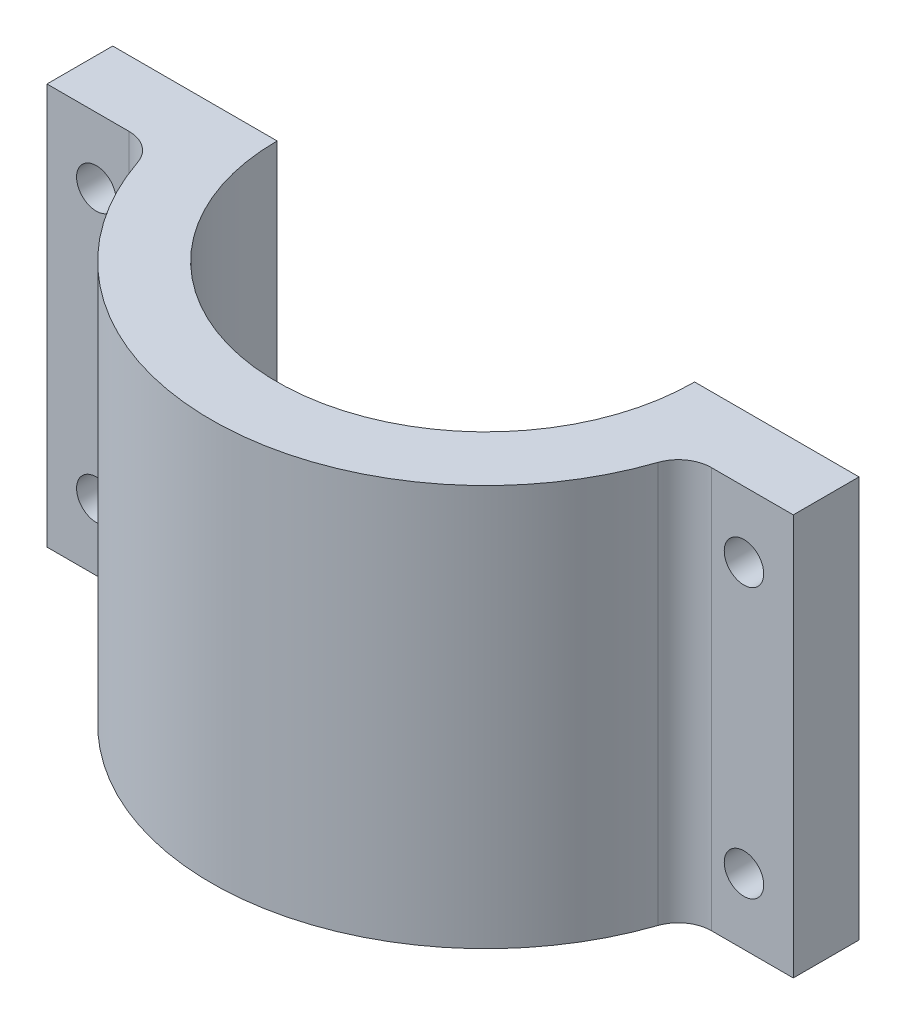
ISO-10303-21;
HEADER;
FILE_DESCRIPTION(('STEP AP214'),'2;1');
FILE_NAME('part.step','',(''),(''),'','','');
FILE_SCHEMA(('AUTOMOTIVE_DESIGN { 1 0 10303 214 1 1 1 1 }'));
ENDSEC;
DATA;
#1=APPLICATION_CONTEXT('core data for automotive mechanical design processes');
#2=APPLICATION_PROTOCOL_DEFINITION('international standard','automotive_design',2000,#1);
#3=PRODUCT_CONTEXT('',#1,'mechanical');
#4=PRODUCT('Part','Part','',(#3));
#5=PRODUCT_RELATED_PRODUCT_CATEGORY('part','',(#4));
#6=PRODUCT_DEFINITION_FORMATION('','',#4);
#7=PRODUCT_DEFINITION_CONTEXT('part definition',#1,'design');
#8=PRODUCT_DEFINITION('design','',#6,#7);
#9=PRODUCT_DEFINITION_SHAPE('','',#8);
#10=(LENGTH_UNIT() NAMED_UNIT(*) SI_UNIT(.MILLI.,.METRE.));
#11=(NAMED_UNIT(*) PLANE_ANGLE_UNIT() SI_UNIT($,.RADIAN.));
#12=(NAMED_UNIT(*) SI_UNIT($,.STERADIAN.) SOLID_ANGLE_UNIT());
#13=UNCERTAINTY_MEASURE_WITH_UNIT(LENGTH_MEASURE(1.E-05),#10,'distance_accuracy_value','');
#14=(GEOMETRIC_REPRESENTATION_CONTEXT(3) GLOBAL_UNCERTAINTY_ASSIGNED_CONTEXT((#13)) GLOBAL_UNIT_ASSIGNED_CONTEXT((#10,
#11,#12)) REPRESENTATION_CONTEXT('',''));
#15=CARTESIAN_POINT('',(0.,0.,0.));
#16=DIRECTION('',(0.,0.,1.));
#17=DIRECTION('',(1.,0.,0.));
#18=AXIS2_PLACEMENT_3D('',#15,#16,#17);
#19=CARTESIAN_POINT('',(0.,61.,0.));
#20=DIRECTION('',(0.,-1.,0.));
#21=DIRECTION('',(0.,0.,-1.));
#22=AXIS2_PLACEMENT_3D('',#19,#20,#21);
#23=CYLINDRICAL_SURFACE('',#22,31.75);
#24=CARTESIAN_POINT('',(0.,0.,0.));
#25=DIRECTION('',(0.,-1.,0.));
#26=DIRECTION('',(0.,0.,1.));
#27=AXIS2_PLACEMENT_3D('',#24,#25,#26);
#28=CIRCLE('',#27,31.75);
#29=CARTESIAN_POINT('',(31.75,0.,0.));
#30=VERTEX_POINT('',#29);
#31=CARTESIAN_POINT('',(-31.75,0.,0.));
#32=VERTEX_POINT('',#31);
#33=EDGE_CURVE('E133',#30,#32,#28,.T.);
#34=ORIENTED_EDGE('',*,*,#33,.T.);
#35=DIRECTION('',(0.,-1.,0.));
#36=VECTOR('',#35,1.);
#37=CARTESIAN_POINT('',(-31.75,61.,0.));
#38=LINE('',#37,#36);
#39=CARTESIAN_POINT('',(-31.75,61.,0.));
#40=VERTEX_POINT('',#39);
#41=EDGE_CURVE('E114',#40,#32,#38,.T.);
#42=ORIENTED_EDGE('',*,*,#41,.F.);
#43=CARTESIAN_POINT('',(0.,61.,0.));
#44=DIRECTION('',(0.,-1.,0.));
#45=DIRECTION('',(0.,0.,1.));
#46=AXIS2_PLACEMENT_3D('',#43,#44,#45);
#47=CIRCLE('',#46,31.75);
#48=CARTESIAN_POINT('',(31.75,61.,0.));
#49=VERTEX_POINT('',#48);
#50=EDGE_CURVE('E121',#49,#40,#47,.T.);
#51=ORIENTED_EDGE('',*,*,#50,.F.);
#52=DIRECTION('',(0.,-1.,0.));
#53=VECTOR('',#52,1.);
#54=CARTESIAN_POINT('',(31.75,61.,0.));
#55=LINE('',#54,#53);
#56=EDGE_CURVE('E189',#49,#30,#55,.T.);
#57=ORIENTED_EDGE('',*,*,#56,.T.);
#58=EDGE_LOOP('',(#34,#42,#51,#57));
#59=FACE_BOUND('',#58,.T.);
#60=ADVANCED_FACE('F33',(#59),#23,.F.);
#61=CARTESIAN_POINT('',(-41.75,61.,0.));
#62=DIRECTION('',(0.,0.,1.));
#63=DIRECTION('',(1.,0.,0.));
#64=AXIS2_PLACEMENT_3D('',#61,#62,#63);
#65=PLANE('',#64);
#66=CARTESIAN_POINT('',(-49.25,10.,0.));
#67=DIRECTION('',(0.,0.,1.));
#68=DIRECTION('',(1.,0.,0.));
#69=AXIS2_PLACEMENT_3D('',#66,#67,#68);
#70=CIRCLE('',#69,3.);
#71=CARTESIAN_POINT('',(-46.25,10.,0.));
#72=VERTEX_POINT('',#71);
#73=EDGE_CURVE('E213',#72,#72,#70,.T.);
#74=ORIENTED_EDGE('',*,*,#73,.T.);
#75=EDGE_LOOP('',(#74));
#76=FACE_BOUND('',#75,.T.);
#77=CARTESIAN_POINT('',(-49.25,51.,0.));
#78=DIRECTION('',(0.,0.,1.));
#79=DIRECTION('',(1.,0.,0.));
#80=AXIS2_PLACEMENT_3D('',#77,#78,#79);
#81=CIRCLE('',#80,3.);
#82=CARTESIAN_POINT('',(-46.25,51.,0.));
#83=VERTEX_POINT('',#82);
#84=EDGE_CURVE('E204',#83,#83,#81,.T.);
#85=ORIENTED_EDGE('',*,*,#84,.T.);
#86=EDGE_LOOP('',(#85));
#87=FACE_BOUND('',#86,.T.);
#88=DIRECTION('',(-1.,0.,0.));
#89=VECTOR('',#88,1.);
#90=CARTESIAN_POINT('',(-41.75,0.,0.));
#91=LINE('',#90,#89);
#92=CARTESIAN_POINT('',(-56.75,0.,0.));
#93=VERTEX_POINT('',#92);
#94=EDGE_CURVE('E200',#32,#93,#91,.T.);
#95=ORIENTED_EDGE('',*,*,#94,.T.);
#96=DIRECTION('',(0.,-1.,0.));
#97=VECTOR('',#96,1.);
#98=CARTESIAN_POINT('',(-56.75,61.,0.));
#99=LINE('',#98,#97);
#100=CARTESIAN_POINT('',(-56.75,61.,0.));
#101=VERTEX_POINT('',#100);
#102=EDGE_CURVE('E117',#101,#93,#99,.T.);
#103=ORIENTED_EDGE('',*,*,#102,.F.);
#104=DIRECTION('',(-1.,0.,0.));
#105=VECTOR('',#104,1.);
#106=CARTESIAN_POINT('',(-31.75,61.,0.));
#107=LINE('',#106,#105);
#108=EDGE_CURVE('E110',#40,#101,#107,.T.);
#109=ORIENTED_EDGE('',*,*,#108,.F.);
#110=ORIENTED_EDGE('',*,*,#41,.T.);
#111=EDGE_LOOP('',(#95,#103,#109,#110));
#112=FACE_BOUND('',#111,.T.);
#113=ADVANCED_FACE('F112',(#76,#87,#112),#65,.F.);
#114=CARTESIAN_POINT('',(-56.75,61.,0.));
#115=DIRECTION('',(1.,0.,0.));
#116=DIRECTION('',(0.,0.,-1.));
#117=AXIS2_PLACEMENT_3D('',#114,#115,#116);
#118=PLANE('',#117);
#119=DIRECTION('',(0.,0.,1.));
#120=VECTOR('',#119,1.);
#121=CARTESIAN_POINT('',(-56.75,0.,0.));
#122=LINE('',#121,#120);
#123=CARTESIAN_POINT('',(-56.75,0.,10.));
#124=VERTEX_POINT('',#123);
#125=EDGE_CURVE('E182',#93,#124,#122,.T.);
#126=ORIENTED_EDGE('',*,*,#125,.T.);
#127=DIRECTION('',(0.,-1.,0.));
#128=VECTOR('',#127,1.);
#129=CARTESIAN_POINT('',(-56.75,61.,10.));
#130=LINE('',#129,#128);
#131=CARTESIAN_POINT('',(-56.75,61.,10.));
#132=VERTEX_POINT('',#131);
#133=EDGE_CURVE('E139',#132,#124,#130,.T.);
#134=ORIENTED_EDGE('',*,*,#133,.F.);
#135=DIRECTION('',(0.,0.,1.));
#136=VECTOR('',#135,1.);
#137=CARTESIAN_POINT('',(-56.75,61.,0.));
#138=LINE('',#137,#136);
#139=EDGE_CURVE('E120',#101,#132,#138,.T.);
#140=ORIENTED_EDGE('',*,*,#139,.F.);
#141=ORIENTED_EDGE('',*,*,#102,.T.);
#142=EDGE_LOOP('',(#126,#134,#140,#141));
#143=FACE_BOUND('',#142,.T.);
#144=ADVANCED_FACE('F245',(#143),#118,.F.);
#145=CARTESIAN_POINT('',(-56.75,61.,10.));
#146=DIRECTION('',(0.,0.,-1.));
#147=DIRECTION('',(-1.,0.,0.));
#148=AXIS2_PLACEMENT_3D('',#145,#146,#147);
#149=PLANE('',#148);
#150=CARTESIAN_POINT('',(-49.25,10.,10.));
#151=DIRECTION('',(0.,0.,1.));
#152=DIRECTION('',(1.,0.,0.));
#153=AXIS2_PLACEMENT_3D('',#150,#151,#152);
#154=CIRCLE('',#153,3.);
#155=CARTESIAN_POINT('',(-46.25,10.,10.));
#156=VERTEX_POINT('',#155);
#157=EDGE_CURVE('E228',#156,#156,#154,.T.);
#158=ORIENTED_EDGE('',*,*,#157,.F.);
#159=EDGE_LOOP('',(#158));
#160=FACE_BOUND('',#159,.T.);
#161=CARTESIAN_POINT('',(-49.25,51.,10.));
#162=DIRECTION('',(0.,0.,1.));
#163=DIRECTION('',(1.,0.,0.));
#164=AXIS2_PLACEMENT_3D('',#161,#162,#163);
#165=CIRCLE('',#164,3.);
#166=CARTESIAN_POINT('',(-46.25,51.,10.));
#167=VERTEX_POINT('',#166);
#168=EDGE_CURVE('E210',#167,#167,#165,.T.);
#169=ORIENTED_EDGE('',*,*,#168,.F.);
#170=EDGE_LOOP('',(#169));
#171=FACE_BOUND('',#170,.T.);
#172=DIRECTION('',(1.,0.,0.));
#173=VECTOR('',#172,1.);
#174=CARTESIAN_POINT('',(-56.75,0.,10.));
#175=LINE('',#174,#173);
#176=CARTESIAN_POINT('',(-44.2782395765685,0.,10.));
#177=VERTEX_POINT('',#176);
#178=EDGE_CURVE('E178',#124,#177,#175,.T.);
#179=ORIENTED_EDGE('',*,*,#178,.T.);
#180=DIRECTION('',(0.,1.,0.));
#181=VECTOR('',#180,1.);
#182=CARTESIAN_POINT('',(-44.2782395765685,61.,10.));
#183=LINE('',#182,#181);
#184=CARTESIAN_POINT('',(-44.2782395765685,61.,10.));
#185=VERTEX_POINT('',#184);
#186=EDGE_CURVE('E48',#177,#185,#183,.T.);
#187=ORIENTED_EDGE('',*,*,#186,.T.);
#188=DIRECTION('',(1.,0.,0.));
#189=VECTOR('',#188,1.);
#190=CARTESIAN_POINT('',(-56.75,61.,10.));
#191=LINE('',#190,#189);
#192=EDGE_CURVE('E197',#132,#185,#191,.T.);
#193=ORIENTED_EDGE('',*,*,#192,.F.);
#194=ORIENTED_EDGE('',*,*,#133,.T.);
#195=EDGE_LOOP('',(#179,#187,#193,#194));
#196=FACE_BOUND('',#195,.T.);
#197=ADVANCED_FACE('F196',(#160,#171,#196),#149,.F.);
#198=CARTESIAN_POINT('',(0.,61.,0.));
#199=DIRECTION('',(0.,-1.,0.));
#200=DIRECTION('',(0.,0.,-1.));
#201=AXIS2_PLACEMENT_3D('',#198,#199,#200);
#202=CYLINDRICAL_SURFACE('',#201,41.75);
#203=CARTESIAN_POINT('',(0.,0.,0.));
#204=DIRECTION('',(0.,1.,0.));
#205=DIRECTION('',(0.,0.,1.));
#206=AXIS2_PLACEMENT_3D('',#203,#204,#205);
#207=CIRCLE('',#206,41.75);
#208=CARTESIAN_POINT('',(-39.5425989801441,0.,13.3957219251337));
#209=VERTEX_POINT('',#208);
#210=CARTESIAN_POINT('',(39.5425989801441,0.,13.3957219251337));
#211=VERTEX_POINT('',#210);
#212=EDGE_CURVE('E172',#209,#211,#207,.T.);
#213=ORIENTED_EDGE('',*,*,#212,.T.);
#214=DIRECTION('',(0.,-1.,0.));
#215=VECTOR('',#214,1.);
#216=CARTESIAN_POINT('',(39.5425989801441,61.,13.3957219251337));
#217=LINE('',#216,#215);
#218=CARTESIAN_POINT('',(39.5425989801441,61.,13.3957219251337));
#219=VERTEX_POINT('',#218);
#220=EDGE_CURVE('E145',#211,#219,#217,.F.);
#221=ORIENTED_EDGE('',*,*,#220,.T.);
#222=CARTESIAN_POINT('',(0.,61.,0.));
#223=DIRECTION('',(0.,1.,0.));
#224=DIRECTION('',(0.,0.,1.));
#225=AXIS2_PLACEMENT_3D('',#222,#223,#224);
#226=CIRCLE('',#225,41.75);
#227=CARTESIAN_POINT('',(-39.5425989801441,61.,13.3957219251337));
#228=VERTEX_POINT('',#227);
#229=EDGE_CURVE('E157',#228,#219,#226,.T.);
#230=ORIENTED_EDGE('',*,*,#229,.F.);
#231=DIRECTION('',(0.,-1.,0.));
#232=VECTOR('',#231,1.);
#233=CARTESIAN_POINT('',(-39.5425989801441,61.,13.3957219251337));
#234=LINE('',#233,#232);
#235=EDGE_CURVE('E137',#228,#209,#234,.T.);
#236=ORIENTED_EDGE('',*,*,#235,.T.);
#237=EDGE_LOOP('',(#213,#221,#230,#236));
#238=FACE_BOUND('',#237,.T.);
#239=ADVANCED_FACE('F176',(#238),#202,.T.);
#240=CARTESIAN_POINT('',(56.75,61.,10.));
#241=DIRECTION('',(0.,0.,-1.));
#242=DIRECTION('',(-1.,0.,0.));
#243=AXIS2_PLACEMENT_3D('',#240,#241,#242);
#244=PLANE('',#243);
#245=CARTESIAN_POINT('',(49.25,51.,10.));
#246=DIRECTION('',(0.,0.,1.));
#247=DIRECTION('',(-1.,0.,0.));
#248=AXIS2_PLACEMENT_3D('',#245,#246,#247);
#249=CIRCLE('',#248,3.);
#250=CARTESIAN_POINT('',(46.25,51.,10.));
#251=VERTEX_POINT('',#250);
#252=EDGE_CURVE('E216',#251,#251,#249,.T.);
#253=ORIENTED_EDGE('',*,*,#252,.F.);
#254=EDGE_LOOP('',(#253));
#255=FACE_BOUND('',#254,.T.);
#256=CARTESIAN_POINT('',(49.25,10.,10.));
#257=DIRECTION('',(0.,0.,1.));
#258=DIRECTION('',(-1.,0.,0.));
#259=AXIS2_PLACEMENT_3D('',#256,#257,#258);
#260=CIRCLE('',#259,3.);
#261=CARTESIAN_POINT('',(46.25,10.,10.));
#262=VERTEX_POINT('',#261);
#263=EDGE_CURVE('E222',#262,#262,#260,.T.);
#264=ORIENTED_EDGE('',*,*,#263,.F.);
#265=EDGE_LOOP('',(#264));
#266=FACE_BOUND('',#265,.T.);
#267=DIRECTION('',(1.,0.,0.));
#268=VECTOR('',#267,1.);
#269=CARTESIAN_POINT('',(56.75,61.,10.));
#270=LINE('',#269,#268);
#271=CARTESIAN_POINT('',(44.2782395765685,61.,10.));
#272=VERTEX_POINT('',#271);
#273=CARTESIAN_POINT('',(56.75,61.,10.));
#274=VERTEX_POINT('',#273);
#275=EDGE_CURVE('E154',#272,#274,#270,.T.);
#276=ORIENTED_EDGE('',*,*,#275,.F.);
#277=DIRECTION('',(0.,1.,0.));
#278=VECTOR('',#277,1.);
#279=CARTESIAN_POINT('',(44.2782395765685,0.,10.));
#280=LINE('',#279,#278);
#281=CARTESIAN_POINT('',(44.2782395765685,0.,10.));
#282=VERTEX_POINT('',#281);
#283=EDGE_CURVE('E134',#272,#282,#280,.F.);
#284=ORIENTED_EDGE('',*,*,#283,.T.);
#285=DIRECTION('',(1.,0.,0.));
#286=VECTOR('',#285,1.);
#287=CARTESIAN_POINT('',(56.75,0.,10.));
#288=LINE('',#287,#286);
#289=CARTESIAN_POINT('',(56.75,0.,10.));
#290=VERTEX_POINT('',#289);
#291=EDGE_CURVE('E174',#282,#290,#288,.T.);
#292=ORIENTED_EDGE('',*,*,#291,.T.);
#293=DIRECTION('',(0.,-1.,0.));
#294=VECTOR('',#293,1.);
#295=CARTESIAN_POINT('',(56.75,61.,10.));
#296=LINE('',#295,#294);
#297=EDGE_CURVE('E165',#274,#290,#296,.T.);
#298=ORIENTED_EDGE('',*,*,#297,.F.);
#299=EDGE_LOOP('',(#276,#284,#292,#298));
#300=FACE_BOUND('',#299,.T.);
#301=ADVANCED_FACE('F162',(#255,#266,#300),#244,.F.);
#302=CARTESIAN_POINT('',(56.75,61.,0.));
#303=DIRECTION('',(-1.,0.,0.));
#304=DIRECTION('',(0.,0.,1.));
#305=AXIS2_PLACEMENT_3D('',#302,#303,#304);
#306=PLANE('',#305);
#307=DIRECTION('',(0.,0.,-1.));
#308=VECTOR('',#307,1.);
#309=CARTESIAN_POINT('',(56.75,0.,0.));
#310=LINE('',#309,#308);
#311=CARTESIAN_POINT('',(56.75,0.,0.));
#312=VERTEX_POINT('',#311);
#313=EDGE_CURVE('E180',#290,#312,#310,.T.);
#314=ORIENTED_EDGE('',*,*,#313,.T.);
#315=DIRECTION('',(0.,-1.,0.));
#316=VECTOR('',#315,1.);
#317=CARTESIAN_POINT('',(56.75,61.,0.));
#318=LINE('',#317,#316);
#319=CARTESIAN_POINT('',(56.75,61.,0.));
#320=VERTEX_POINT('',#319);
#321=EDGE_CURVE('E191',#320,#312,#318,.T.);
#322=ORIENTED_EDGE('',*,*,#321,.F.);
#323=DIRECTION('',(0.,0.,-1.));
#324=VECTOR('',#323,1.);
#325=CARTESIAN_POINT('',(56.75,61.,0.));
#326=LINE('',#325,#324);
#327=EDGE_CURVE('E167',#274,#320,#326,.T.);
#328=ORIENTED_EDGE('',*,*,#327,.F.);
#329=ORIENTED_EDGE('',*,*,#297,.T.);
#330=EDGE_LOOP('',(#314,#322,#328,#329));
#331=FACE_BOUND('',#330,.T.);
#332=ADVANCED_FACE('F284',(#331),#306,.F.);
#333=CARTESIAN_POINT('',(31.75,61.,0.));
#334=DIRECTION('',(0.,0.,1.));
#335=DIRECTION('',(1.,0.,0.));
#336=AXIS2_PLACEMENT_3D('',#333,#334,#335);
#337=PLANE('',#336);
#338=CARTESIAN_POINT('',(49.25,51.,0.));
#339=DIRECTION('',(0.,0.,1.));
#340=DIRECTION('',(-1.,0.,0.));
#341=AXIS2_PLACEMENT_3D('',#338,#339,#340);
#342=CIRCLE('',#341,3.);
#343=CARTESIAN_POINT('',(46.25,51.,0.));
#344=VERTEX_POINT('',#343);
#345=EDGE_CURVE('E219',#344,#344,#342,.T.);
#346=ORIENTED_EDGE('',*,*,#345,.T.);
#347=EDGE_LOOP('',(#346));
#348=FACE_BOUND('',#347,.T.);
#349=CARTESIAN_POINT('',(49.25,10.,0.));
#350=DIRECTION('',(0.,0.,1.));
#351=DIRECTION('',(-1.,0.,0.));
#352=AXIS2_PLACEMENT_3D('',#349,#350,#351);
#353=CIRCLE('',#352,3.);
#354=CARTESIAN_POINT('',(46.25,10.,0.));
#355=VERTEX_POINT('',#354);
#356=EDGE_CURVE('E225',#355,#355,#353,.T.);
#357=ORIENTED_EDGE('',*,*,#356,.T.);
#358=EDGE_LOOP('',(#357));
#359=FACE_BOUND('',#358,.T.);
#360=DIRECTION('',(-1.,0.,0.));
#361=VECTOR('',#360,1.);
#362=CARTESIAN_POINT('',(31.75,0.,0.));
#363=LINE('',#362,#361);
#364=EDGE_CURVE('E130',#312,#30,#363,.T.);
#365=ORIENTED_EDGE('',*,*,#364,.T.);
#366=ORIENTED_EDGE('',*,*,#56,.F.);
#367=DIRECTION('',(-1.,0.,0.));
#368=VECTOR('',#367,1.);
#369=CARTESIAN_POINT('',(41.75,61.,0.));
#370=LINE('',#369,#368);
#371=EDGE_CURVE('E126',#320,#49,#370,.T.);
#372=ORIENTED_EDGE('',*,*,#371,.F.);
#373=ORIENTED_EDGE('',*,*,#321,.T.);
#374=EDGE_LOOP('',(#365,#366,#372,#373));
#375=FACE_BOUND('',#374,.T.);
#376=ADVANCED_FACE('F288',(#348,#359,#375),#337,.F.);
#377=CARTESIAN_POINT('',(0.,61.,0.));
#378=DIRECTION('',(0.,1.,0.));
#379=DIRECTION('',(0.,0.,1.));
#380=AXIS2_PLACEMENT_3D('',#377,#378,#379);
#381=PLANE('',#380);
#382=ORIENTED_EDGE('',*,*,#50,.T.);
#383=ORIENTED_EDGE('',*,*,#108,.T.);
#384=ORIENTED_EDGE('',*,*,#139,.T.);
#385=ORIENTED_EDGE('',*,*,#192,.T.);
#386=CARTESIAN_POINT('',(-44.2782395765685,61.,15.));
#387=DIRECTION('',(0.,1.,0.));
#388=DIRECTION('',(0.,0.,1.));
#389=AXIS2_PLACEMENT_3D('',#386,#387,#388);
#390=CIRCLE('',#389,5.);
#391=EDGE_CURVE('E11',#185,#228,#390,.F.);
#392=ORIENTED_EDGE('',*,*,#391,.T.);
#393=ORIENTED_EDGE('',*,*,#229,.T.);
#394=CARTESIAN_POINT('',(44.2782395765685,61.,15.));
#395=DIRECTION('',(0.,1.,0.));
#396=DIRECTION('',(0.,0.,1.));
#397=AXIS2_PLACEMENT_3D('',#394,#395,#396);
#398=CIRCLE('',#397,5.);
#399=EDGE_CURVE('E150',#219,#272,#398,.F.);
#400=ORIENTED_EDGE('',*,*,#399,.T.);
#401=ORIENTED_EDGE('',*,*,#275,.T.);
#402=ORIENTED_EDGE('',*,*,#327,.T.);
#403=ORIENTED_EDGE('',*,*,#371,.T.);
#404=EDGE_LOOP('',(#382,#383,#384,#385,#392,#393,#400,#401,#402,#403));
#405=FACE_BOUND('',#404,.T.);
#406=ADVANCED_FACE('F124',(#405),#381,.T.);
#407=CARTESIAN_POINT('',(0.,0.,0.));
#408=DIRECTION('',(0.,1.,0.));
#409=DIRECTION('',(0.,0.,1.));
#410=AXIS2_PLACEMENT_3D('',#407,#408,#409);
#411=PLANE('',#410);
#412=ORIENTED_EDGE('',*,*,#33,.F.);
#413=ORIENTED_EDGE('',*,*,#364,.F.);
#414=ORIENTED_EDGE('',*,*,#313,.F.);
#415=ORIENTED_EDGE('',*,*,#291,.F.);
#416=CARTESIAN_POINT('',(44.2782395765685,0.,15.));
#417=DIRECTION('',(0.,1.,0.));
#418=DIRECTION('',(0.,0.,1.));
#419=AXIS2_PLACEMENT_3D('',#416,#417,#418);
#420=CIRCLE('',#419,5.);
#421=EDGE_CURVE('E148',#282,#211,#420,.T.);
#422=ORIENTED_EDGE('',*,*,#421,.T.);
#423=ORIENTED_EDGE('',*,*,#212,.F.);
#424=CARTESIAN_POINT('',(-44.2782395765685,0.,15.));
#425=DIRECTION('',(0.,1.,0.));
#426=DIRECTION('',(0.,0.,1.));
#427=AXIS2_PLACEMENT_3D('',#424,#425,#426);
#428=CIRCLE('',#427,5.);
#429=EDGE_CURVE('E41',#209,#177,#428,.T.);
#430=ORIENTED_EDGE('',*,*,#429,.T.);
#431=ORIENTED_EDGE('',*,*,#178,.F.);
#432=ORIENTED_EDGE('',*,*,#125,.F.);
#433=ORIENTED_EDGE('',*,*,#94,.F.);
#434=EDGE_LOOP('',(#412,#413,#414,#415,#422,#423,#430,#431,#432,#433));
#435=FACE_BOUND('',#434,.T.);
#436=ADVANCED_FACE('F171',(#435),#411,.F.);
#437=CARTESIAN_POINT('',(49.25,10.,0.));
#438=DIRECTION('',(0.,0.,1.));
#439=DIRECTION('',(1.,0.,0.));
#440=AXIS2_PLACEMENT_3D('',#437,#438,#439);
#441=CYLINDRICAL_SURFACE('',#440,3.);
#442=ORIENTED_EDGE('',*,*,#356,.F.);
#443=EDGE_LOOP('',(#442));
#444=FACE_BOUND('',#443,.T.);
#445=ORIENTED_EDGE('',*,*,#263,.T.);
#446=EDGE_LOOP('',(#445));
#447=FACE_BOUND('',#446,.T.);
#448=ADVANCED_FACE('F256',(#444,#447),#441,.F.);
#449=CARTESIAN_POINT('',(49.25,51.,0.));
#450=DIRECTION('',(0.,0.,1.));
#451=DIRECTION('',(1.,0.,0.));
#452=AXIS2_PLACEMENT_3D('',#449,#450,#451);
#453=CYLINDRICAL_SURFACE('',#452,3.);
#454=ORIENTED_EDGE('',*,*,#345,.F.);
#455=EDGE_LOOP('',(#454));
#456=FACE_BOUND('',#455,.T.);
#457=ORIENTED_EDGE('',*,*,#252,.T.);
#458=EDGE_LOOP('',(#457));
#459=FACE_BOUND('',#458,.T.);
#460=ADVANCED_FACE('F250',(#456,#459),#453,.F.);
#461=CARTESIAN_POINT('',(-49.25,51.,0.));
#462=DIRECTION('',(0.,0.,1.));
#463=DIRECTION('',(1.,0.,0.));
#464=AXIS2_PLACEMENT_3D('',#461,#462,#463);
#465=CYLINDRICAL_SURFACE('',#464,3.);
#466=ORIENTED_EDGE('',*,*,#84,.F.);
#467=EDGE_LOOP('',(#466));
#468=FACE_BOUND('',#467,.T.);
#469=ORIENTED_EDGE('',*,*,#168,.T.);
#470=EDGE_LOOP('',(#469));
#471=FACE_BOUND('',#470,.T.);
#472=ADVANCED_FACE('F239',(#468,#471),#465,.F.);
#473=CARTESIAN_POINT('',(-49.25,10.,0.));
#474=DIRECTION('',(0.,0.,1.));
#475=DIRECTION('',(1.,0.,0.));
#476=AXIS2_PLACEMENT_3D('',#473,#474,#475);
#477=CYLINDRICAL_SURFACE('',#476,3.);
#478=ORIENTED_EDGE('',*,*,#73,.F.);
#479=EDGE_LOOP('',(#478));
#480=FACE_BOUND('',#479,.T.);
#481=ORIENTED_EDGE('',*,*,#157,.T.);
#482=EDGE_LOOP('',(#481));
#483=FACE_BOUND('',#482,.T.);
#484=ADVANCED_FACE('F236',(#480,#483),#477,.F.);
#485=CARTESIAN_POINT('',(44.2782395765685,61.,15.));
#486=DIRECTION('',(0.,-1.,0.));
#487=DIRECTION('',(0.,0.,-1.));
#488=AXIS2_PLACEMENT_3D('',#485,#486,#487);
#489=CYLINDRICAL_SURFACE('',#488,5.);
#490=ORIENTED_EDGE('',*,*,#399,.F.);
#491=ORIENTED_EDGE('',*,*,#220,.F.);
#492=ORIENTED_EDGE('',*,*,#421,.F.);
#493=ORIENTED_EDGE('',*,*,#283,.F.);
#494=EDGE_LOOP('',(#490,#491,#492,#493));
#495=FACE_BOUND('',#494,.T.);
#496=ADVANCED_FACE('F169',(#495),#489,.F.);
#497=CARTESIAN_POINT('',(-44.2782395765685,61.,15.));
#498=DIRECTION('',(0.,-1.,0.));
#499=DIRECTION('',(0.,0.,-1.));
#500=AXIS2_PLACEMENT_3D('',#497,#498,#499);
#501=CYLINDRICAL_SURFACE('',#500,5.);
#502=ORIENTED_EDGE('',*,*,#391,.F.);
#503=ORIENTED_EDGE('',*,*,#186,.F.);
#504=ORIENTED_EDGE('',*,*,#429,.F.);
#505=ORIENTED_EDGE('',*,*,#235,.F.);
#506=EDGE_LOOP('',(#502,#503,#504,#505));
#507=FACE_BOUND('',#506,.T.);
#508=ADVANCED_FACE('F35',(#507),#501,.F.);
#509=CLOSED_SHELL('',(#60,#113,#144,#197,#239,#301,#332,#376,#406,#436,#448,#460,#472,#484,#496,#508));
#510=MANIFOLD_SOLID_BREP('B2',#509);
#511=ADVANCED_BREP_SHAPE_REPRESENTATION('',(#18,#510),#14);
#512=SHAPE_DEFINITION_REPRESENTATION(#9,#511);
ENDSEC;
END-ISO-10303-21;
